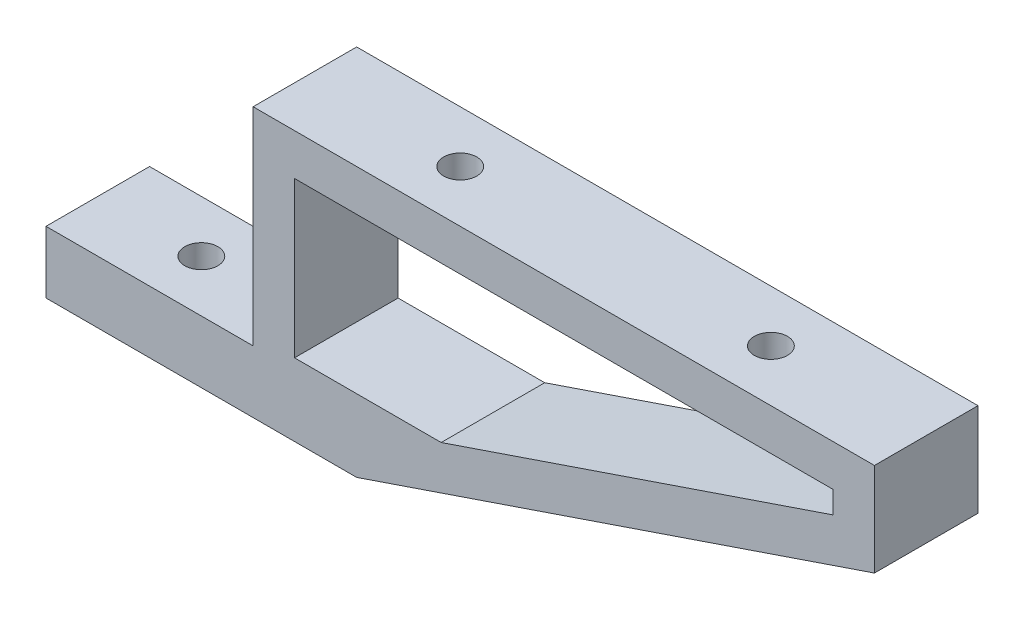
ISO-10303-21;
HEADER;
FILE_DESCRIPTION(('STEP AP214'),'2;1');
FILE_NAME('part.step','',(''),(''),'','','');
FILE_SCHEMA(('AUTOMOTIVE_DESIGN { 1 0 10303 214 1 1 1 1 }'));
ENDSEC;
DATA;
#1=APPLICATION_CONTEXT('core data for automotive mechanical design processes');
#2=APPLICATION_PROTOCOL_DEFINITION('international standard','automotive_design',2000,#1);
#3=PRODUCT_CONTEXT('',#1,'mechanical');
#4=PRODUCT('Part','Part','',(#3));
#5=PRODUCT_RELATED_PRODUCT_CATEGORY('part','',(#4));
#6=PRODUCT_DEFINITION_FORMATION('','',#4);
#7=PRODUCT_DEFINITION_CONTEXT('part definition',#1,'design');
#8=PRODUCT_DEFINITION('design','',#6,#7);
#9=PRODUCT_DEFINITION_SHAPE('','',#8);
#10=(LENGTH_UNIT() NAMED_UNIT(*) SI_UNIT(.MILLI.,.METRE.));
#11=(NAMED_UNIT(*) PLANE_ANGLE_UNIT() SI_UNIT($,.RADIAN.));
#12=(NAMED_UNIT(*) SI_UNIT($,.STERADIAN.) SOLID_ANGLE_UNIT());
#13=UNCERTAINTY_MEASURE_WITH_UNIT(LENGTH_MEASURE(1.E-05),#10,'distance_accuracy_value','');
#14=(GEOMETRIC_REPRESENTATION_CONTEXT(3) GLOBAL_UNCERTAINTY_ASSIGNED_CONTEXT((#13)) GLOBAL_UNIT_ASSIGNED_CONTEXT((#10,
#11,#12)) REPRESENTATION_CONTEXT('',''));
#15=CARTESIAN_POINT('',(0.,0.,0.));
#16=DIRECTION('',(0.,0.,1.));
#17=DIRECTION('',(1.,0.,0.));
#18=AXIS2_PLACEMENT_3D('',#15,#16,#17);
#19=CARTESIAN_POINT('',(0.,0.,10.));
#20=DIRECTION('',(0.,0.,-1.));
#21=DIRECTION('',(-1.,0.,0.));
#22=AXIS2_PLACEMENT_3D('',#19,#20,#21);
#23=PLANE('',#22);
#24=DIRECTION('',(0.,-1.,0.));
#25=VECTOR('',#24,1.);
#26=CARTESIAN_POINT('',(0.,-6.,10.));
#27=LINE('',#26,#25);
#28=CARTESIAN_POINT('',(0.,0.,10.));
#29=VERTEX_POINT('',#28);
#30=CARTESIAN_POINT('',(0.,-6.,10.));
#31=VERTEX_POINT('',#30);
#32=EDGE_CURVE('E178',#29,#31,#27,.T.);
#33=ORIENTED_EDGE('',*,*,#32,.T.);
#34=DIRECTION('',(1.,0.,0.));
#35=VECTOR('',#34,1.);
#36=CARTESIAN_POINT('',(30.,-6.,10.));
#37=LINE('',#36,#35);
#38=CARTESIAN_POINT('',(30.,-6.,10.));
#39=VERTEX_POINT('',#38);
#40=EDGE_CURVE('E181',#31,#39,#37,.T.);
#41=ORIENTED_EDGE('',*,*,#40,.T.);
#42=DIRECTION('',(0.946772744819713,0.321902733238702,0.));
#43=VECTOR('',#42,1.);
#44=CARTESIAN_POINT('',(80.,11.,10.));
#45=LINE('',#44,#43);
#46=CARTESIAN_POINT('',(80.,11.,10.));
#47=VERTEX_POINT('',#46);
#48=EDGE_CURVE('E184',#39,#47,#45,.T.);
#49=ORIENTED_EDGE('',*,*,#48,.T.);
#50=DIRECTION('',(0.,1.,0.));
#51=VECTOR('',#50,1.);
#52=CARTESIAN_POINT('',(80.,20.,10.));
#53=LINE('',#52,#51);
#54=CARTESIAN_POINT('',(80.,20.,10.));
#55=VERTEX_POINT('',#54);
#56=EDGE_CURVE('E186',#47,#55,#53,.T.);
#57=ORIENTED_EDGE('',*,*,#56,.T.);
#58=DIRECTION('',(-1.,0.,0.));
#59=VECTOR('',#58,1.);
#60=CARTESIAN_POINT('',(20.,20.,10.));
#61=LINE('',#60,#59);
#62=CARTESIAN_POINT('',(20.,20.,10.));
#63=VERTEX_POINT('',#62);
#64=EDGE_CURVE('E188',#55,#63,#61,.T.);
#65=ORIENTED_EDGE('',*,*,#64,.T.);
#66=DIRECTION('',(0.,-1.,0.));
#67=VECTOR('',#66,1.);
#68=CARTESIAN_POINT('',(20.,0.,10.));
#69=LINE('',#68,#67);
#70=CARTESIAN_POINT('',(20.,0.,10.));
#71=VERTEX_POINT('',#70);
#72=EDGE_CURVE('E190',#63,#71,#69,.T.);
#73=ORIENTED_EDGE('',*,*,#72,.T.);
#74=DIRECTION('',(-1.,0.,0.));
#75=VECTOR('',#74,1.);
#76=CARTESIAN_POINT('',(0.,0.,10.));
#77=LINE('',#76,#75);
#78=EDGE_CURVE('E192',#71,#29,#77,.T.);
#79=ORIENTED_EDGE('',*,*,#78,.T.);
#80=EDGE_LOOP('',(#33,#41,#49,#57,#65,#73,#79));
#81=FACE_BOUND('',#80,.T.);
#82=DIRECTION('',(-1.,0.,0.));
#83=VECTOR('',#82,1.);
#84=CARTESIAN_POINT('',(76.,16.,10.));
#85=LINE('',#84,#83);
#86=CARTESIAN_POINT('',(76.,16.,10.));
#87=VERTEX_POINT('',#86);
#88=CARTESIAN_POINT('',(24.,16.,10.));
#89=VERTEX_POINT('',#88);
#90=EDGE_CURVE('E132',#87,#89,#85,.T.);
#91=ORIENTED_EDGE('',*,*,#90,.F.);
#92=DIRECTION('',(0.,1.,0.));
#93=VECTOR('',#92,1.);
#94=CARTESIAN_POINT('',(76.,13.8648786964835,10.));
#95=LINE('',#94,#93);
#96=CARTESIAN_POINT('',(76.,13.8648786964835,10.));
#97=VERTEX_POINT('',#96);
#98=EDGE_CURVE('E160',#97,#87,#95,.T.);
#99=ORIENTED_EDGE('',*,*,#98,.F.);
#100=DIRECTION('',(0.946772744819713,0.321902733238702,0.));
#101=VECTOR('',#100,1.);
#102=CARTESIAN_POINT('',(38.1621214809309,1.,10.));
#103=LINE('',#102,#101);
#104=CARTESIAN_POINT('',(38.1621214809309,1.,10.));
#105=VERTEX_POINT('',#104);
#106=EDGE_CURVE('E155',#105,#97,#103,.T.);
#107=ORIENTED_EDGE('',*,*,#106,.F.);
#108=DIRECTION('',(1.,0.,0.));
#109=VECTOR('',#108,1.);
#110=CARTESIAN_POINT('',(24.,1.,10.));
#111=LINE('',#110,#109);
#112=CARTESIAN_POINT('',(24.,1.,10.));
#113=VERTEX_POINT('',#112);
#114=EDGE_CURVE('E153',#113,#105,#111,.T.);
#115=ORIENTED_EDGE('',*,*,#114,.F.);
#116=DIRECTION('',(0.,-1.,0.));
#117=VECTOR('',#116,1.);
#118=CARTESIAN_POINT('',(24.,16.,10.));
#119=LINE('',#118,#117);
#120=EDGE_CURVE('E140',#89,#113,#119,.T.);
#121=ORIENTED_EDGE('',*,*,#120,.F.);
#122=EDGE_LOOP('',(#91,#99,#107,#115,#121));
#123=FACE_BOUND('',#122,.T.);
#124=ADVANCED_FACE('F43',(#81,#123),#23,.F.);
#125=CARTESIAN_POINT('',(0.,0.,0.));
#126=DIRECTION('',(0.,0.,-1.));
#127=DIRECTION('',(-1.,0.,0.));
#128=AXIS2_PLACEMENT_3D('',#125,#126,#127);
#129=PLANE('',#128);
#130=DIRECTION('',(0.,-1.,0.));
#131=VECTOR('',#130,1.);
#132=CARTESIAN_POINT('',(0.,-6.,0.));
#133=LINE('',#132,#131);
#134=CARTESIAN_POINT('',(0.,0.,0.));
#135=VERTEX_POINT('',#134);
#136=CARTESIAN_POINT('',(0.,-6.,0.));
#137=VERTEX_POINT('',#136);
#138=EDGE_CURVE('E148',#135,#137,#133,.T.);
#139=ORIENTED_EDGE('',*,*,#138,.F.);
#140=DIRECTION('',(-1.,0.,0.));
#141=VECTOR('',#140,1.);
#142=CARTESIAN_POINT('',(0.,0.,0.));
#143=LINE('',#142,#141);
#144=CARTESIAN_POINT('',(20.,0.,0.));
#145=VERTEX_POINT('',#144);
#146=EDGE_CURVE('E182',#145,#135,#143,.T.);
#147=ORIENTED_EDGE('',*,*,#146,.F.);
#148=DIRECTION('',(0.,-1.,0.));
#149=VECTOR('',#148,1.);
#150=CARTESIAN_POINT('',(20.,0.,0.));
#151=LINE('',#150,#149);
#152=CARTESIAN_POINT('',(20.,20.,0.));
#153=VERTEX_POINT('',#152);
#154=EDGE_CURVE('E205',#153,#145,#151,.T.);
#155=ORIENTED_EDGE('',*,*,#154,.F.);
#156=DIRECTION('',(-1.,0.,0.));
#157=VECTOR('',#156,1.);
#158=CARTESIAN_POINT('',(20.,20.,0.));
#159=LINE('',#158,#157);
#160=CARTESIAN_POINT('',(80.,20.,0.));
#161=VERTEX_POINT('',#160);
#162=EDGE_CURVE('E203',#161,#153,#159,.T.);
#163=ORIENTED_EDGE('',*,*,#162,.F.);
#164=DIRECTION('',(0.,1.,0.));
#165=VECTOR('',#164,1.);
#166=CARTESIAN_POINT('',(80.,20.,0.));
#167=LINE('',#166,#165);
#168=CARTESIAN_POINT('',(80.,11.,0.));
#169=VERTEX_POINT('',#168);
#170=EDGE_CURVE('E201',#169,#161,#167,.T.);
#171=ORIENTED_EDGE('',*,*,#170,.F.);
#172=DIRECTION('',(0.946772744819713,0.321902733238702,0.));
#173=VECTOR('',#172,1.);
#174=CARTESIAN_POINT('',(80.,11.,0.));
#175=LINE('',#174,#173);
#176=CARTESIAN_POINT('',(30.,-6.,0.));
#177=VERTEX_POINT('',#176);
#178=EDGE_CURVE('E199',#177,#169,#175,.T.);
#179=ORIENTED_EDGE('',*,*,#178,.F.);
#180=DIRECTION('',(1.,0.,0.));
#181=VECTOR('',#180,1.);
#182=CARTESIAN_POINT('',(30.,-6.,0.));
#183=LINE('',#182,#181);
#184=EDGE_CURVE('E197',#137,#177,#183,.T.);
#185=ORIENTED_EDGE('',*,*,#184,.F.);
#186=EDGE_LOOP('',(#139,#147,#155,#163,#171,#179,#185));
#187=FACE_BOUND('',#186,.T.);
#188=DIRECTION('',(0.,1.,0.));
#189=VECTOR('',#188,1.);
#190=CARTESIAN_POINT('',(76.,13.8648786964835,0.));
#191=LINE('',#190,#189);
#192=CARTESIAN_POINT('',(76.,13.8648786964835,0.));
#193=VERTEX_POINT('',#192);
#194=CARTESIAN_POINT('',(76.,16.,0.));
#195=VERTEX_POINT('',#194);
#196=EDGE_CURVE('E141',#193,#195,#191,.T.);
#197=ORIENTED_EDGE('',*,*,#196,.T.);
#198=DIRECTION('',(-1.,0.,0.));
#199=VECTOR('',#198,1.);
#200=CARTESIAN_POINT('',(76.,16.,0.));
#201=LINE('',#200,#199);
#202=CARTESIAN_POINT('',(24.,16.,0.));
#203=VERTEX_POINT('',#202);
#204=EDGE_CURVE('E66',#195,#203,#201,.T.);
#205=ORIENTED_EDGE('',*,*,#204,.T.);
#206=DIRECTION('',(0.,-1.,0.));
#207=VECTOR('',#206,1.);
#208=CARTESIAN_POINT('',(24.,16.,0.));
#209=LINE('',#208,#207);
#210=CARTESIAN_POINT('',(24.,1.,0.));
#211=VERTEX_POINT('',#210);
#212=EDGE_CURVE('E147',#203,#211,#209,.T.);
#213=ORIENTED_EDGE('',*,*,#212,.T.);
#214=DIRECTION('',(1.,0.,0.));
#215=VECTOR('',#214,1.);
#216=CARTESIAN_POINT('',(24.,1.,0.));
#217=LINE('',#216,#215);
#218=CARTESIAN_POINT('',(38.1621214809309,1.,0.));
#219=VERTEX_POINT('',#218);
#220=EDGE_CURVE('E165',#211,#219,#217,.T.);
#221=ORIENTED_EDGE('',*,*,#220,.T.);
#222=DIRECTION('',(0.946772744819713,0.321902733238702,0.));
#223=VECTOR('',#222,1.);
#224=CARTESIAN_POINT('',(38.1621214809309,1.,0.));
#225=LINE('',#224,#223);
#226=EDGE_CURVE('E168',#219,#193,#225,.T.);
#227=ORIENTED_EDGE('',*,*,#226,.T.);
#228=EDGE_LOOP('',(#197,#205,#213,#221,#227));
#229=FACE_BOUND('',#228,.T.);
#230=ADVANCED_FACE('F232',(#187,#229),#129,.T.);
#231=CARTESIAN_POINT('',(0.,-6.,10.));
#232=DIRECTION('',(1.,0.,0.));
#233=DIRECTION('',(0.,0.,-1.));
#234=AXIS2_PLACEMENT_3D('',#231,#232,#233);
#235=PLANE('',#234);
#236=ORIENTED_EDGE('',*,*,#138,.T.);
#237=DIRECTION('',(0.,0.,-1.));
#238=VECTOR('',#237,1.);
#239=CARTESIAN_POINT('',(0.,-6.,10.));
#240=LINE('',#239,#238);
#241=EDGE_CURVE('E11',#31,#137,#240,.T.);
#242=ORIENTED_EDGE('',*,*,#241,.F.);
#243=ORIENTED_EDGE('',*,*,#32,.F.);
#244=DIRECTION('',(0.,0.,-1.));
#245=VECTOR('',#244,1.);
#246=CARTESIAN_POINT('',(0.,0.,10.));
#247=LINE('',#246,#245);
#248=EDGE_CURVE('E194',#29,#135,#247,.T.);
#249=ORIENTED_EDGE('',*,*,#248,.T.);
#250=EDGE_LOOP('',(#236,#242,#243,#249));
#251=FACE_BOUND('',#250,.T.);
#252=ADVANCED_FACE('F45',(#251),#235,.F.);
#253=CARTESIAN_POINT('',(30.,-6.,10.));
#254=DIRECTION('',(0.,1.,0.));
#255=DIRECTION('',(-1.,0.,0.));
#256=AXIS2_PLACEMENT_3D('',#253,#254,#255);
#257=PLANE('',#256);
#258=CARTESIAN_POINT('',(9.99999999999545,-6.,4.99999999999773));
#259=DIRECTION('',(0.,1.,0.));
#260=DIRECTION('',(0.,0.,1.));
#261=AXIS2_PLACEMENT_3D('',#258,#259,#260);
#262=CIRCLE('',#261,1.6);
#263=CARTESIAN_POINT('',(9.99999999999545,-6.,6.59999999999773));
#264=VERTEX_POINT('',#263);
#265=EDGE_CURVE('E163',#264,#264,#262,.T.);
#266=ORIENTED_EDGE('',*,*,#265,.T.);
#267=EDGE_LOOP('',(#266));
#268=FACE_BOUND('',#267,.T.);
#269=ORIENTED_EDGE('',*,*,#184,.T.);
#270=DIRECTION('',(0.,0.,-1.));
#271=VECTOR('',#270,1.);
#272=CARTESIAN_POINT('',(30.,-6.,10.));
#273=LINE('',#272,#271);
#274=EDGE_CURVE('E51',#39,#177,#273,.T.);
#275=ORIENTED_EDGE('',*,*,#274,.F.);
#276=ORIENTED_EDGE('',*,*,#40,.F.);
#277=ORIENTED_EDGE('',*,*,#241,.T.);
#278=EDGE_LOOP('',(#269,#275,#276,#277));
#279=FACE_BOUND('',#278,.T.);
#280=ADVANCED_FACE('F249',(#268,#279),#257,.F.);
#281=CARTESIAN_POINT('',(80.,11.,10.));
#282=DIRECTION('',(-0.321902733238702,0.946772744819713,0.));
#283=DIRECTION('',(-0.946772744819713,-0.321902733238702,0.));
#284=AXIS2_PLACEMENT_3D('',#281,#282,#283);
#285=PLANE('',#284);
#286=ORIENTED_EDGE('',*,*,#178,.T.);
#287=DIRECTION('',(0.,0.,-1.));
#288=VECTOR('',#287,1.);
#289=CARTESIAN_POINT('',(80.,11.,10.));
#290=LINE('',#289,#288);
#291=EDGE_CURVE('E219',#47,#169,#290,.T.);
#292=ORIENTED_EDGE('',*,*,#291,.F.);
#293=ORIENTED_EDGE('',*,*,#48,.F.);
#294=ORIENTED_EDGE('',*,*,#274,.T.);
#295=EDGE_LOOP('',(#286,#292,#293,#294));
#296=FACE_BOUND('',#295,.T.);
#297=ADVANCED_FACE('F226',(#296),#285,.F.);
#298=CARTESIAN_POINT('',(80.,20.,10.));
#299=DIRECTION('',(-1.,0.,0.));
#300=DIRECTION('',(0.,0.,1.));
#301=AXIS2_PLACEMENT_3D('',#298,#299,#300);
#302=PLANE('',#301);
#303=ORIENTED_EDGE('',*,*,#170,.T.);
#304=DIRECTION('',(0.,0.,-1.));
#305=VECTOR('',#304,1.);
#306=CARTESIAN_POINT('',(80.,20.,10.));
#307=LINE('',#306,#305);
#308=EDGE_CURVE('E216',#55,#161,#307,.T.);
#309=ORIENTED_EDGE('',*,*,#308,.F.);
#310=ORIENTED_EDGE('',*,*,#56,.F.);
#311=ORIENTED_EDGE('',*,*,#291,.T.);
#312=EDGE_LOOP('',(#303,#309,#310,#311));
#313=FACE_BOUND('',#312,.T.);
#314=ADVANCED_FACE('F238',(#313),#302,.F.);
#315=CARTESIAN_POINT('',(20.,20.,10.));
#316=DIRECTION('',(0.,-1.,0.));
#317=DIRECTION('',(1.,0.,0.));
#318=AXIS2_PLACEMENT_3D('',#315,#316,#317);
#319=PLANE('',#318);
#320=CARTESIAN_POINT('',(65.,20.,5.));
#321=DIRECTION('',(0.,1.,0.));
#322=DIRECTION('',(-1.,0.,0.));
#323=AXIS2_PLACEMENT_3D('',#320,#321,#322);
#324=CIRCLE('',#323,1.60000000000001);
#325=CARTESIAN_POINT('',(63.4,20.,5.));
#326=VERTEX_POINT('',#325);
#327=EDGE_CURVE('E305',#326,#326,#324,.T.);
#328=ORIENTED_EDGE('',*,*,#327,.F.);
#329=EDGE_LOOP('',(#328));
#330=FACE_BOUND('',#329,.T.);
#331=CARTESIAN_POINT('',(35.,20.,5.));
#332=DIRECTION('',(0.,1.,0.));
#333=DIRECTION('',(-1.,0.,0.));
#334=AXIS2_PLACEMENT_3D('',#331,#332,#333);
#335=CIRCLE('',#334,1.6);
#336=CARTESIAN_POINT('',(33.4,20.,5.));
#337=VERTEX_POINT('',#336);
#338=EDGE_CURVE('E312',#337,#337,#335,.T.);
#339=ORIENTED_EDGE('',*,*,#338,.F.);
#340=EDGE_LOOP('',(#339));
#341=FACE_BOUND('',#340,.T.);
#342=ORIENTED_EDGE('',*,*,#162,.T.);
#343=DIRECTION('',(0.,0.,-1.));
#344=VECTOR('',#343,1.);
#345=CARTESIAN_POINT('',(20.,20.,10.));
#346=LINE('',#345,#344);
#347=EDGE_CURVE('E213',#63,#153,#346,.T.);
#348=ORIENTED_EDGE('',*,*,#347,.F.);
#349=ORIENTED_EDGE('',*,*,#64,.F.);
#350=ORIENTED_EDGE('',*,*,#308,.T.);
#351=EDGE_LOOP('',(#342,#348,#349,#350));
#352=FACE_BOUND('',#351,.T.);
#353=ADVANCED_FACE('F242',(#330,#341,#352),#319,.F.);
#354=CARTESIAN_POINT('',(20.,0.,10.));
#355=DIRECTION('',(1.,0.,0.));
#356=DIRECTION('',(0.,0.,-1.));
#357=AXIS2_PLACEMENT_3D('',#354,#355,#356);
#358=PLANE('',#357);
#359=ORIENTED_EDGE('',*,*,#154,.T.);
#360=DIRECTION('',(0.,0.,-1.));
#361=VECTOR('',#360,1.);
#362=CARTESIAN_POINT('',(20.,0.,10.));
#363=LINE('',#362,#361);
#364=EDGE_CURVE('E210',#71,#145,#363,.T.);
#365=ORIENTED_EDGE('',*,*,#364,.F.);
#366=ORIENTED_EDGE('',*,*,#72,.F.);
#367=ORIENTED_EDGE('',*,*,#347,.T.);
#368=EDGE_LOOP('',(#359,#365,#366,#367));
#369=FACE_BOUND('',#368,.T.);
#370=ADVANCED_FACE('F257',(#369),#358,.F.);
#371=CARTESIAN_POINT('',(0.,0.,10.));
#372=DIRECTION('',(0.,-1.,0.));
#373=DIRECTION('',(0.,0.,-1.));
#374=AXIS2_PLACEMENT_3D('',#371,#372,#373);
#375=PLANE('',#374);
#376=CARTESIAN_POINT('',(9.99999999999545,0.,4.99999999999773));
#377=DIRECTION('',(0.,1.,0.));
#378=DIRECTION('',(0.,0.,1.));
#379=AXIS2_PLACEMENT_3D('',#376,#377,#378);
#380=CIRCLE('',#379,1.6);
#381=CARTESIAN_POINT('',(9.99999999999545,0.,6.59999999999773));
#382=VERTEX_POINT('',#381);
#383=EDGE_CURVE('E309',#382,#382,#380,.T.);
#384=ORIENTED_EDGE('',*,*,#383,.F.);
#385=EDGE_LOOP('',(#384));
#386=FACE_BOUND('',#385,.T.);
#387=ORIENTED_EDGE('',*,*,#146,.T.);
#388=ORIENTED_EDGE('',*,*,#248,.F.);
#389=ORIENTED_EDGE('',*,*,#78,.F.);
#390=ORIENTED_EDGE('',*,*,#364,.T.);
#391=EDGE_LOOP('',(#387,#388,#389,#390));
#392=FACE_BOUND('',#391,.T.);
#393=ADVANCED_FACE('F254',(#386,#392),#375,.F.);
#394=CARTESIAN_POINT('',(76.,16.,10.));
#395=DIRECTION('',(0.,-1.,0.));
#396=DIRECTION('',(1.,0.,0.));
#397=AXIS2_PLACEMENT_3D('',#394,#395,#396);
#398=PLANE('',#397);
#399=CARTESIAN_POINT('',(65.,16.,5.));
#400=DIRECTION('',(0.,-1.,0.));
#401=DIRECTION('',(1.,0.,0.));
#402=AXIS2_PLACEMENT_3D('',#399,#400,#401);
#403=CIRCLE('',#402,1.60000000000001);
#404=CARTESIAN_POINT('',(66.6,16.,5.));
#405=VERTEX_POINT('',#404);
#406=EDGE_CURVE('E308',#405,#405,#403,.F.);
#407=ORIENTED_EDGE('',*,*,#406,.T.);
#408=EDGE_LOOP('',(#407));
#409=FACE_BOUND('',#408,.T.);
#410=CARTESIAN_POINT('',(35.,16.,5.));
#411=DIRECTION('',(0.,-1.,0.));
#412=DIRECTION('',(1.,0.,0.));
#413=AXIS2_PLACEMENT_3D('',#410,#411,#412);
#414=CIRCLE('',#413,1.6);
#415=CARTESIAN_POINT('',(36.6,16.,5.));
#416=VERTEX_POINT('',#415);
#417=EDGE_CURVE('E315',#416,#416,#414,.F.);
#418=ORIENTED_EDGE('',*,*,#417,.T.);
#419=EDGE_LOOP('',(#418));
#420=FACE_BOUND('',#419,.T.);
#421=ORIENTED_EDGE('',*,*,#204,.F.);
#422=DIRECTION('',(0.,0.,-1.));
#423=VECTOR('',#422,1.);
#424=CARTESIAN_POINT('',(76.,16.,10.));
#425=LINE('',#424,#423);
#426=EDGE_CURVE('E136',#87,#195,#425,.T.);
#427=ORIENTED_EDGE('',*,*,#426,.F.);
#428=ORIENTED_EDGE('',*,*,#90,.T.);
#429=DIRECTION('',(0.,0.,-1.));
#430=VECTOR('',#429,1.);
#431=CARTESIAN_POINT('',(24.,16.,10.));
#432=LINE('',#431,#430);
#433=EDGE_CURVE('E135',#89,#203,#432,.T.);
#434=ORIENTED_EDGE('',*,*,#433,.T.);
#435=EDGE_LOOP('',(#421,#427,#428,#434));
#436=FACE_BOUND('',#435,.T.);
#437=ADVANCED_FACE('F134',(#409,#420,#436),#398,.T.);
#438=CARTESIAN_POINT('',(24.,16.,10.));
#439=DIRECTION('',(1.,0.,0.));
#440=DIRECTION('',(0.,1.,0.));
#441=AXIS2_PLACEMENT_3D('',#438,#439,#440);
#442=PLANE('',#441);
#443=ORIENTED_EDGE('',*,*,#212,.F.);
#444=ORIENTED_EDGE('',*,*,#433,.F.);
#445=ORIENTED_EDGE('',*,*,#120,.T.);
#446=DIRECTION('',(0.,0.,-1.));
#447=VECTOR('',#446,1.);
#448=CARTESIAN_POINT('',(24.,1.,10.));
#449=LINE('',#448,#447);
#450=EDGE_CURVE('E149',#113,#211,#449,.T.);
#451=ORIENTED_EDGE('',*,*,#450,.T.);
#452=EDGE_LOOP('',(#443,#444,#445,#451));
#453=FACE_BOUND('',#452,.T.);
#454=ADVANCED_FACE('F144',(#453),#442,.T.);
#455=CARTESIAN_POINT('',(24.,1.,10.));
#456=DIRECTION('',(0.,1.,0.));
#457=DIRECTION('',(0.,0.,1.));
#458=AXIS2_PLACEMENT_3D('',#455,#456,#457);
#459=PLANE('',#458);
#460=ORIENTED_EDGE('',*,*,#220,.F.);
#461=ORIENTED_EDGE('',*,*,#450,.F.);
#462=ORIENTED_EDGE('',*,*,#114,.T.);
#463=DIRECTION('',(0.,0.,-1.));
#464=VECTOR('',#463,1.);
#465=CARTESIAN_POINT('',(38.1621214809309,1.,10.));
#466=LINE('',#465,#464);
#467=EDGE_CURVE('E175',#105,#219,#466,.T.);
#468=ORIENTED_EDGE('',*,*,#467,.T.);
#469=EDGE_LOOP('',(#460,#461,#462,#468));
#470=FACE_BOUND('',#469,.T.);
#471=ADVANCED_FACE('F278',(#470),#459,.T.);
#472=CARTESIAN_POINT('',(38.1621214809309,1.,10.));
#473=DIRECTION('',(-0.321902733238702,0.946772744819713,0.));
#474=DIRECTION('',(-0.946772744819713,-0.321902733238702,0.));
#475=AXIS2_PLACEMENT_3D('',#472,#473,#474);
#476=PLANE('',#475);
#477=ORIENTED_EDGE('',*,*,#226,.F.);
#478=ORIENTED_EDGE('',*,*,#467,.F.);
#479=ORIENTED_EDGE('',*,*,#106,.T.);
#480=DIRECTION('',(0.,0.,-1.));
#481=VECTOR('',#480,1.);
#482=CARTESIAN_POINT('',(76.,13.8648786964835,10.));
#483=LINE('',#482,#481);
#484=EDGE_CURVE('E58',#97,#193,#483,.T.);
#485=ORIENTED_EDGE('',*,*,#484,.T.);
#486=EDGE_LOOP('',(#477,#478,#479,#485));
#487=FACE_BOUND('',#486,.T.);
#488=ADVANCED_FACE('F281',(#487),#476,.T.);
#489=CARTESIAN_POINT('',(76.,13.8648786964835,10.));
#490=DIRECTION('',(-1.,0.,0.));
#491=DIRECTION('',(0.,0.,1.));
#492=AXIS2_PLACEMENT_3D('',#489,#490,#491);
#493=PLANE('',#492);
#494=ORIENTED_EDGE('',*,*,#196,.F.);
#495=ORIENTED_EDGE('',*,*,#484,.F.);
#496=ORIENTED_EDGE('',*,*,#98,.T.);
#497=ORIENTED_EDGE('',*,*,#426,.T.);
#498=EDGE_LOOP('',(#494,#495,#496,#497));
#499=FACE_BOUND('',#498,.T.);
#500=ADVANCED_FACE('F285',(#499),#493,.T.);
#501=CARTESIAN_POINT('',(9.99999999999545,-6.,4.99999999999773));
#502=DIRECTION('',(0.,1.,0.));
#503=DIRECTION('',(0.,0.,1.));
#504=AXIS2_PLACEMENT_3D('',#501,#502,#503);
#505=CYLINDRICAL_SURFACE('',#504,1.6);
#506=ORIENTED_EDGE('',*,*,#265,.F.);
#507=EDGE_LOOP('',(#506));
#508=FACE_BOUND('',#507,.T.);
#509=ORIENTED_EDGE('',*,*,#383,.T.);
#510=EDGE_LOOP('',(#509));
#511=FACE_BOUND('',#510,.T.);
#512=ADVANCED_FACE('F289',(#508,#511),#505,.F.);
#513=CARTESIAN_POINT('',(35.,11.4745166004061,5.));
#514=DIRECTION('',(0.,1.,0.));
#515=DIRECTION('',(-1.,0.,0.));
#516=AXIS2_PLACEMENT_3D('',#513,#514,#515);
#517=CYLINDRICAL_SURFACE('',#516,1.6);
#518=ORIENTED_EDGE('',*,*,#338,.T.);
#519=EDGE_LOOP('',(#518));
#520=FACE_BOUND('',#519,.T.);
#521=ORIENTED_EDGE('',*,*,#417,.F.);
#522=EDGE_LOOP('',(#521));
#523=FACE_BOUND('',#522,.T.);
#524=ADVANCED_FACE('F292',(#520,#523),#517,.F.);
#525=CARTESIAN_POINT('',(65.,11.4745166004061,5.));
#526=DIRECTION('',(0.,1.,0.));
#527=DIRECTION('',(-1.,0.,0.));
#528=AXIS2_PLACEMENT_3D('',#525,#526,#527);
#529=CYLINDRICAL_SURFACE('',#528,1.60000000000001);
#530=ORIENTED_EDGE('',*,*,#327,.T.);
#531=EDGE_LOOP('',(#530));
#532=FACE_BOUND('',#531,.T.);
#533=ORIENTED_EDGE('',*,*,#406,.F.);
#534=EDGE_LOOP('',(#533));
#535=FACE_BOUND('',#534,.T.);
#536=ADVANCED_FACE('F296',(#532,#535),#529,.F.);
#537=CLOSED_SHELL('',(#124,#230,#252,#280,#297,#314,#353,#370,#393,#437,#454,#471,#488,#500,
#512,#524,#536));
#538=MANIFOLD_SOLID_BREP('B2',#537);
#539=ADVANCED_BREP_SHAPE_REPRESENTATION('',(#18,#538),#14);
#540=SHAPE_DEFINITION_REPRESENTATION(#9,#539);
ENDSEC;
END-ISO-10303-21;
